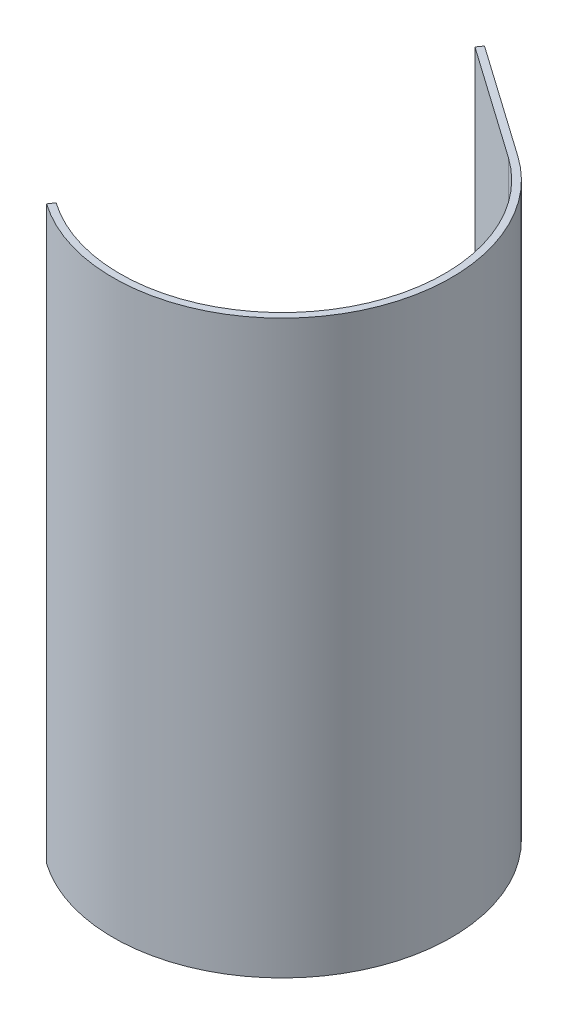
ISO-10303-21;
HEADER;
FILE_DESCRIPTION(('STEP AP214'),'2;1');
FILE_NAME('part.step','',(''),(''),'','','');
FILE_SCHEMA(('AUTOMOTIVE_DESIGN { 1 0 10303 214 1 1 1 1 }'));
ENDSEC;
DATA;
#1=APPLICATION_CONTEXT('core data for automotive mechanical design processes');
#2=APPLICATION_PROTOCOL_DEFINITION('international standard','automotive_design',2000,#1);
#3=PRODUCT_CONTEXT('',#1,'mechanical');
#4=PRODUCT('Part','Part','',(#3));
#5=PRODUCT_RELATED_PRODUCT_CATEGORY('part','',(#4));
#6=PRODUCT_DEFINITION_FORMATION('','',#4);
#7=PRODUCT_DEFINITION_CONTEXT('part definition',#1,'design');
#8=PRODUCT_DEFINITION('design','',#6,#7);
#9=PRODUCT_DEFINITION_SHAPE('','',#8);
#10=(LENGTH_UNIT() NAMED_UNIT(*) SI_UNIT(.MILLI.,.METRE.));
#11=(NAMED_UNIT(*) PLANE_ANGLE_UNIT() SI_UNIT($,.RADIAN.));
#12=(NAMED_UNIT(*) SI_UNIT($,.STERADIAN.) SOLID_ANGLE_UNIT());
#13=UNCERTAINTY_MEASURE_WITH_UNIT(LENGTH_MEASURE(1.E-05),#10,'distance_accuracy_value','');
#14=(GEOMETRIC_REPRESENTATION_CONTEXT(3) GLOBAL_UNCERTAINTY_ASSIGNED_CONTEXT((#13)) GLOBAL_UNIT_ASSIGNED_CONTEXT((#10,
#11,#12)) REPRESENTATION_CONTEXT('',''));
#15=CARTESIAN_POINT('',(0.,0.,0.));
#16=DIRECTION('',(0.,0.,1.));
#17=DIRECTION('',(1.,0.,0.));
#18=AXIS2_PLACEMENT_3D('',#15,#16,#17);
#19=CARTESIAN_POINT('',(0.,250.,0.));
#20=DIRECTION('',(0.,-1.,0.));
#21=DIRECTION('',(0.,0.,-1.));
#22=AXIS2_PLACEMENT_3D('',#19,#20,#21);
#23=CYLINDRICAL_SURFACE('',#22,71.);
#24=CARTESIAN_POINT('',(0.,0.,0.));
#25=DIRECTION('',(0.,1.,0.));
#26=DIRECTION('',(0.,0.,1.));
#27=AXIS2_PLACEMENT_3D('',#24,#25,#26);
#28=CIRCLE('',#27,71.);
#29=CARTESIAN_POINT('',(-40.8205189367041,0.,58.0920410532991));
#30=VERTEX_POINT('',#29);
#31=CARTESIAN_POINT('',(40.8205189367041,0.,-58.0920410532991));
#32=VERTEX_POINT('',#31);
#33=EDGE_CURVE('E118',#30,#32,#28,.T.);
#34=ORIENTED_EDGE('',*,*,#33,.F.);
#35=DIRECTION('',(0.,-1.,0.));
#36=VECTOR('',#35,1.);
#37=CARTESIAN_POINT('',(-40.8205189367041,250.,58.0920410532991));
#38=LINE('',#37,#36);
#39=CARTESIAN_POINT('',(-40.8205189367041,250.,58.0920410532991));
#40=VERTEX_POINT('',#39);
#41=EDGE_CURVE('E11',#40,#30,#38,.T.);
#42=ORIENTED_EDGE('',*,*,#41,.F.);
#43=CARTESIAN_POINT('',(0.,250.,0.));
#44=DIRECTION('',(0.,1.,0.));
#45=DIRECTION('',(0.,0.,1.));
#46=AXIS2_PLACEMENT_3D('',#43,#44,#45);
#47=CIRCLE('',#46,71.);
#48=CARTESIAN_POINT('',(40.8205189367041,250.,-58.0920410532991));
#49=VERTEX_POINT('',#48);
#50=EDGE_CURVE('E52',#40,#49,#47,.T.);
#51=ORIENTED_EDGE('',*,*,#50,.T.);
#52=DIRECTION('',(0.,-1.,0.));
#53=VECTOR('',#52,1.);
#54=CARTESIAN_POINT('',(40.8205189367041,250.,-58.0920410532991));
#55=LINE('',#54,#53);
#56=EDGE_CURVE('E129',#49,#32,#55,.T.);
#57=ORIENTED_EDGE('',*,*,#56,.T.);
#58=EDGE_LOOP('',(#34,#42,#51,#57));
#59=FACE_BOUND('',#58,.T.);
#60=ADVANCED_FACE('F36',(#59),#23,.F.);
#61=CARTESIAN_POINT('',(0.,250.,0.));
#62=DIRECTION('',(0.818197761314071,0.,0.574936886432452));
#63=DIRECTION('',(0.574936886432452,0.,-0.818197761314071));
#64=AXIS2_PLACEMENT_3D('',#61,#62,#63);
#65=PLANE('',#64);
#66=DIRECTION('',(-0.574936886432452,0.,0.818197761314071));
#67=VECTOR('',#66,1.);
#68=CARTESIAN_POINT('',(0.,0.,0.));
#69=LINE('',#68,#67);
#70=CARTESIAN_POINT('',(-42.5453295960014,0.,60.5466343372413));
#71=VERTEX_POINT('',#70);
#72=EDGE_CURVE('E66',#30,#71,#69,.T.);
#73=ORIENTED_EDGE('',*,*,#72,.T.);
#74=DIRECTION('',(0.,-1.,0.));
#75=VECTOR('',#74,1.);
#76=CARTESIAN_POINT('',(-42.5453295960014,250.,60.5466343372413));
#77=LINE('',#76,#75);
#78=CARTESIAN_POINT('',(-42.5453295960014,250.,60.5466343372413));
#79=VERTEX_POINT('',#78);
#80=EDGE_CURVE('E44',#79,#71,#77,.T.);
#81=ORIENTED_EDGE('',*,*,#80,.F.);
#82=DIRECTION('',(-0.574936886432452,0.,0.818197761314071));
#83=VECTOR('',#82,1.);
#84=CARTESIAN_POINT('',(0.,250.,0.));
#85=LINE('',#84,#83);
#86=EDGE_CURVE('E126',#40,#79,#85,.T.);
#87=ORIENTED_EDGE('',*,*,#86,.F.);
#88=ORIENTED_EDGE('',*,*,#41,.T.);
#89=EDGE_LOOP('',(#73,#81,#87,#88));
#90=FACE_BOUND('',#89,.T.);
#91=ADVANCED_FACE('F146',(#90),#65,.F.);
#92=CARTESIAN_POINT('',(0.,250.,0.));
#93=DIRECTION('',(0.,-1.,0.));
#94=DIRECTION('',(0.,0.,-1.));
#95=AXIS2_PLACEMENT_3D('',#92,#93,#94);
#96=CYLINDRICAL_SURFACE('',#95,74.);
#97=CARTESIAN_POINT('',(0.,0.,0.));
#98=DIRECTION('',(0.,1.,0.));
#99=DIRECTION('',(0.,0.,1.));
#100=AXIS2_PLACEMENT_3D('',#97,#98,#99);
#101=CIRCLE('',#100,74.);
#102=CARTESIAN_POINT('',(42.5453295960014,0.,-60.5466343372413));
#103=VERTEX_POINT('',#102);
#104=EDGE_CURVE('E73',#71,#103,#101,.T.);
#105=ORIENTED_EDGE('',*,*,#104,.T.);
#106=DIRECTION('',(0.,-1.,0.));
#107=VECTOR('',#106,1.);
#108=CARTESIAN_POINT('',(42.5453295960014,250.,-60.5466343372413));
#109=LINE('',#108,#107);
#110=CARTESIAN_POINT('',(42.5453295960014,250.,-60.5466343372413));
#111=VERTEX_POINT('',#110);
#112=EDGE_CURVE('E117',#111,#103,#109,.T.);
#113=ORIENTED_EDGE('',*,*,#112,.F.);
#114=CARTESIAN_POINT('',(0.,250.,0.));
#115=DIRECTION('',(0.,1.,0.));
#116=DIRECTION('',(0.,0.,1.));
#117=AXIS2_PLACEMENT_3D('',#114,#115,#116);
#118=CIRCLE('',#117,74.);
#119=EDGE_CURVE('E128',#79,#111,#118,.T.);
#120=ORIENTED_EDGE('',*,*,#119,.F.);
#121=ORIENTED_EDGE('',*,*,#80,.T.);
#122=EDGE_LOOP('',(#105,#113,#120,#121));
#123=FACE_BOUND('',#122,.T.);
#124=ADVANCED_FACE('F135',(#123),#96,.T.);
#125=CARTESIAN_POINT('',(0.,250.,0.));
#126=DIRECTION('',(0.,1.,0.));
#127=DIRECTION('',(0.,0.,1.));
#128=AXIS2_PLACEMENT_3D('',#125,#126,#127);
#129=PLANE('',#128);
#130=ORIENTED_EDGE('',*,*,#50,.F.);
#131=ORIENTED_EDGE('',*,*,#86,.T.);
#132=ORIENTED_EDGE('',*,*,#119,.T.);
#133=DIRECTION('',(0.818197761314072,0.,0.574936886432452));
#134=VECTOR('',#133,1.);
#135=CARTESIAN_POINT('',(-6.54653608284286,250.,-95.0428475231884));
#136=LINE('',#135,#134);
#137=CARTESIAN_POINT('',(-6.54653608284286,250.,-95.0428475231884));
#138=VERTEX_POINT('',#137);
#139=EDGE_CURVE('E141',#138,#111,#136,.T.);
#140=ORIENTED_EDGE('',*,*,#139,.F.);
#141=DIRECTION('',(0.574936886432452,0.,-0.818197761314072));
#142=VECTOR('',#141,1.);
#143=CARTESIAN_POINT('',(-49.0918656788443,250.,-34.4962131859471));
#144=LINE('',#143,#142);
#145=CARTESIAN_POINT('',(-8.27134674214021,250.,-92.5882542392462));
#146=VERTEX_POINT('',#145);
#147=EDGE_CURVE('E111',#146,#138,#144,.T.);
#148=ORIENTED_EDGE('',*,*,#147,.F.);
#149=DIRECTION('',(0.818197761314072,0.,0.574936886432452));
#150=VECTOR('',#149,1.);
#151=CARTESIAN_POINT('',(-8.27134674214021,250.,-92.5882542392462));
#152=LINE('',#151,#150);
#153=EDGE_CURVE('E121',#146,#49,#152,.T.);
#154=ORIENTED_EDGE('',*,*,#153,.T.);
#155=EDGE_LOOP('',(#130,#131,#132,#140,#148,#154));
#156=FACE_BOUND('',#155,.T.);
#157=ADVANCED_FACE('F145',(#156),#129,.T.);
#158=CARTESIAN_POINT('',(0.,0.,0.));
#159=DIRECTION('',(0.,1.,0.));
#160=DIRECTION('',(0.,0.,1.));
#161=AXIS2_PLACEMENT_3D('',#158,#159,#160);
#162=PLANE('',#161);
#163=ORIENTED_EDGE('',*,*,#33,.T.);
#164=DIRECTION('',(0.818197761314072,0.,0.574936886432452));
#165=VECTOR('',#164,1.);
#166=CARTESIAN_POINT('',(-8.27134674214022,0.,-92.5882542392462));
#167=LINE('',#166,#165);
#168=CARTESIAN_POINT('',(-8.27134674214022,0.,-92.5882542392462));
#169=VERTEX_POINT('',#168);
#170=EDGE_CURVE('E102',#169,#32,#167,.T.);
#171=ORIENTED_EDGE('',*,*,#170,.F.);
#172=DIRECTION('',(-0.574936886432452,0.,0.818197761314072));
#173=VECTOR('',#172,1.);
#174=CARTESIAN_POINT('',(-49.0918656788443,0.,-34.4962131859471));
#175=LINE('',#174,#173);
#176=CARTESIAN_POINT('',(-6.54653608284286,0.,-95.0428475231884));
#177=VERTEX_POINT('',#176);
#178=EDGE_CURVE('E95',#177,#169,#175,.T.);
#179=ORIENTED_EDGE('',*,*,#178,.F.);
#180=DIRECTION('',(0.818197761314072,0.,0.574936886432452));
#181=VECTOR('',#180,1.);
#182=CARTESIAN_POINT('',(-6.54653608284286,0.,-95.0428475231884));
#183=LINE('',#182,#181);
#184=EDGE_CURVE('E99',#177,#103,#183,.T.);
#185=ORIENTED_EDGE('',*,*,#184,.T.);
#186=ORIENTED_EDGE('',*,*,#104,.F.);
#187=ORIENTED_EDGE('',*,*,#72,.F.);
#188=EDGE_LOOP('',(#163,#171,#179,#185,#186,#187));
#189=FACE_BOUND('',#188,.T.);
#190=ADVANCED_FACE('F97',(#189),#162,.F.);
#191=CARTESIAN_POINT('',(-6.54653608284286,0.,-95.0428475231884));
#192=DIRECTION('',(-0.574936886432452,0.,0.818197761314072));
#193=DIRECTION('',(0.818197761314072,0.,0.574936886432452));
#194=AXIS2_PLACEMENT_3D('',#191,#192,#193);
#195=PLANE('',#194);
#196=ORIENTED_EDGE('',*,*,#112,.T.);
#197=ORIENTED_EDGE('',*,*,#184,.F.);
#198=DIRECTION('',(0.,-1.,0.));
#199=VECTOR('',#198,1.);
#200=CARTESIAN_POINT('',(-6.54653608284286,0.,-95.0428475231884));
#201=LINE('',#200,#199);
#202=EDGE_CURVE('E106',#138,#177,#201,.T.);
#203=ORIENTED_EDGE('',*,*,#202,.F.);
#204=ORIENTED_EDGE('',*,*,#139,.T.);
#205=EDGE_LOOP('',(#196,#197,#203,#204));
#206=FACE_BOUND('',#205,.T.);
#207=ADVANCED_FACE('F116',(#206),#195,.F.);
#208=CARTESIAN_POINT('',(-8.27134674214022,0.,-92.5882542392462));
#209=DIRECTION('',(0.574936886432452,0.,-0.818197761314072));
#210=DIRECTION('',(-0.818197761314072,0.,-0.574936886432452));
#211=AXIS2_PLACEMENT_3D('',#208,#209,#210);
#212=PLANE('',#211);
#213=ORIENTED_EDGE('',*,*,#56,.F.);
#214=ORIENTED_EDGE('',*,*,#153,.F.);
#215=DIRECTION('',(0.,1.,0.));
#216=VECTOR('',#215,1.);
#217=CARTESIAN_POINT('',(-8.27134674214022,0.,-92.5882542392462));
#218=LINE('',#217,#216);
#219=EDGE_CURVE('E105',#169,#146,#218,.T.);
#220=ORIENTED_EDGE('',*,*,#219,.F.);
#221=ORIENTED_EDGE('',*,*,#170,.T.);
#222=EDGE_LOOP('',(#213,#214,#220,#221));
#223=FACE_BOUND('',#222,.T.);
#224=ADVANCED_FACE('F139',(#223),#212,.F.);
#225=CARTESIAN_POINT('',(-49.0918656788443,0.,-34.4962131859471));
#226=DIRECTION('',(-0.818197761314071,0.,-0.574936886432452));
#227=DIRECTION('',(-0.574936886432452,0.,0.818197761314072));
#228=AXIS2_PLACEMENT_3D('',#225,#226,#227);
#229=PLANE('',#228);
#230=ORIENTED_EDGE('',*,*,#202,.T.);
#231=ORIENTED_EDGE('',*,*,#178,.T.);
#232=ORIENTED_EDGE('',*,*,#219,.T.);
#233=ORIENTED_EDGE('',*,*,#147,.T.);
#234=EDGE_LOOP('',(#230,#231,#232,#233));
#235=FACE_BOUND('',#234,.T.);
#236=ADVANCED_FACE('F109',(#235),#229,.T.);
#237=CLOSED_SHELL('',(#60,#91,#124,#157,#190,#207,#224,#236));
#238=MANIFOLD_SOLID_BREP('B2',#237);
#239=ADVANCED_BREP_SHAPE_REPRESENTATION('',(#18,#238),#14);
#240=SHAPE_DEFINITION_REPRESENTATION(#9,#239);
ENDSEC;
END-ISO-10303-21;
